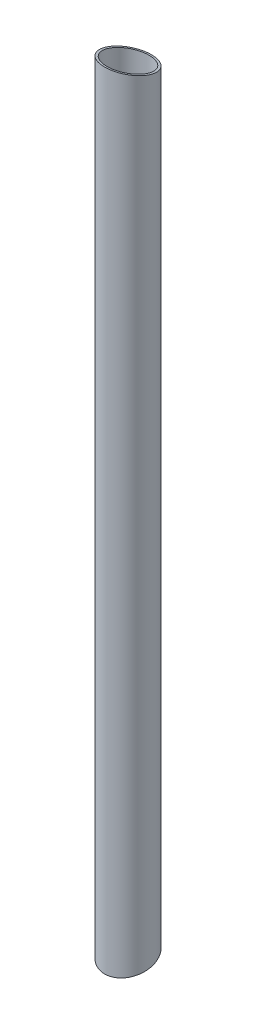
ISO-10303-21;
HEADER;
FILE_DESCRIPTION(('STEP AP214'),'2;1');
FILE_NAME('part.step','',(''),(''),'','','');
FILE_SCHEMA(('AUTOMOTIVE_DESIGN { 1 0 10303 214 1 1 1 1 }'));
ENDSEC;
DATA;
#1=APPLICATION_CONTEXT('core data for automotive mechanical design processes');
#2=APPLICATION_PROTOCOL_DEFINITION('international standard','automotive_design',2000,#1);
#3=PRODUCT_CONTEXT('',#1,'mechanical');
#4=PRODUCT('Part','Part','',(#3));
#5=PRODUCT_RELATED_PRODUCT_CATEGORY('part','',(#4));
#6=PRODUCT_DEFINITION_FORMATION('','',#4);
#7=PRODUCT_DEFINITION_CONTEXT('part definition',#1,'design');
#8=PRODUCT_DEFINITION('design','',#6,#7);
#9=PRODUCT_DEFINITION_SHAPE('','',#8);
#10=(LENGTH_UNIT() NAMED_UNIT(*) SI_UNIT(.MILLI.,.METRE.));
#11=(NAMED_UNIT(*) PLANE_ANGLE_UNIT() SI_UNIT($,.RADIAN.));
#12=(NAMED_UNIT(*) SI_UNIT($,.STERADIAN.) SOLID_ANGLE_UNIT());
#13=UNCERTAINTY_MEASURE_WITH_UNIT(LENGTH_MEASURE(1.E-05),#10,'distance_accuracy_value','');
#14=(GEOMETRIC_REPRESENTATION_CONTEXT(3) GLOBAL_UNCERTAINTY_ASSIGNED_CONTEXT((#13)) GLOBAL_UNIT_ASSIGNED_CONTEXT((#10,
#11,#12)) REPRESENTATION_CONTEXT('',''));
#15=CARTESIAN_POINT('',(0.,0.,0.));
#16=DIRECTION('',(0.,0.,1.));
#17=DIRECTION('',(1.,0.,0.));
#18=AXIS2_PLACEMENT_3D('',#15,#16,#17);
#19=CARTESIAN_POINT('',(-642.62,-196.85,0.));
#20=DIRECTION('',(0.,1.,0.));
#21=DIRECTION('',(0.,0.,1.));
#22=AXIS2_PLACEMENT_3D('',#19,#20,#21);
#23=CYLINDRICAL_SURFACE('',#22,11.4554);
#24=CARTESIAN_POINT('',(-642.62,-210.002229432809,0.));
#25=DIRECTION('',(0.,-0.96561575852067,-0.259973473447873));
#26=DIRECTION('',(0.,0.259973473447873,-0.96561575852067));
#27=AXIS2_PLACEMENT_3D('',#24,#25,#26);
#28=ELLIPSE('',#27,11.863310948394,11.4554);
#29=CARTESIAN_POINT('',(-642.62,-206.918083278963,-11.4554));
#30=VERTEX_POINT('',#29);
#31=EDGE_CURVE('E46',#30,#30,#28,.T.);
#32=ORIENTED_EDGE('',*,*,#31,.T.);
#33=EDGE_LOOP('',(#32));
#34=FACE_BOUND('',#33,.T.);
#35=CARTESIAN_POINT('',(-642.62,210.002229432809,0.));
#36=DIRECTION('',(0.,0.96561575852067,-0.259973473447873));
#37=DIRECTION('',(0.,0.259973473447873,0.96561575852067));
#38=AXIS2_PLACEMENT_3D('',#35,#36,#37);
#39=ELLIPSE('',#38,11.863310948394,11.4554);
#40=CARTESIAN_POINT('',(-642.62,213.086375586656,11.4554));
#41=VERTEX_POINT('',#40);
#42=EDGE_CURVE('E36',#41,#41,#39,.T.);
#43=ORIENTED_EDGE('',*,*,#42,.T.);
#44=EDGE_LOOP('',(#43));
#45=FACE_BOUND('',#44,.T.);
#46=ADVANCED_FACE('F32',(#34,#45),#23,.F.);
#47=CARTESIAN_POINT('',(-642.62,-196.85,0.));
#48=DIRECTION('',(0.,1.,0.));
#49=DIRECTION('',(0.,0.,1.));
#50=AXIS2_PLACEMENT_3D('',#47,#48,#49);
#51=CYLINDRICAL_SURFACE('',#50,12.7);
#52=CARTESIAN_POINT('',(-642.62,-210.002229432809,0.));
#53=DIRECTION('',(0.,-0.96561575852067,-0.259973473447873));
#54=DIRECTION('',(0.,0.259973473447873,-0.96561575852067));
#55=AXIS2_PLACEMENT_3D('',#52,#53,#54);
#56=ELLIPSE('',#55,13.1522294328092,12.7);
#57=CARTESIAN_POINT('',(-642.62,-206.582998663579,-12.6999999999999));
#58=VERTEX_POINT('',#57);
#59=EDGE_CURVE('E40',#58,#58,#56,.T.);
#60=ORIENTED_EDGE('',*,*,#59,.F.);
#61=EDGE_LOOP('',(#60));
#62=FACE_BOUND('',#61,.T.);
#63=CARTESIAN_POINT('',(-642.62,210.002229432809,0.));
#64=DIRECTION('',(0.,0.96561575852067,-0.259973473447873));
#65=DIRECTION('',(0.,0.259973473447873,0.96561575852067));
#66=AXIS2_PLACEMENT_3D('',#63,#64,#65);
#67=ELLIPSE('',#66,13.1522294328092,12.7);
#68=CARTESIAN_POINT('',(-642.62,213.42146020204,12.7));
#69=VERTEX_POINT('',#68);
#70=EDGE_CURVE('E10',#69,#69,#67,.T.);
#71=ORIENTED_EDGE('',*,*,#70,.F.);
#72=EDGE_LOOP('',(#71));
#73=FACE_BOUND('',#72,.T.);
#74=ADVANCED_FACE('F59',(#62,#73),#51,.T.);
#75=CARTESIAN_POINT('',(-655.319999999999,-209.113320133213,-3.30166311278795));
#76=DIRECTION('',(0.,-0.96561575852067,-0.259973473447873));
#77=DIRECTION('',(0.,0.259973473447873,-0.96561575852067));
#78=AXIS2_PLACEMENT_3D('',#75,#76,#77);
#79=PLANE('',#78);
#80=ORIENTED_EDGE('',*,*,#31,.F.);
#81=EDGE_LOOP('',(#80));
#82=FACE_BOUND('',#81,.T.);
#83=ORIENTED_EDGE('',*,*,#59,.T.);
#84=EDGE_LOOP('',(#83));
#85=FACE_BOUND('',#84,.T.);
#86=ADVANCED_FACE('F55',(#82,#85),#79,.T.);
#87=CARTESIAN_POINT('',(-629.92,209.113320133213,-3.30166311278791));
#88=DIRECTION('',(0.,0.96561575852067,-0.259973473447873));
#89=DIRECTION('',(0.,0.259973473447873,0.96561575852067));
#90=AXIS2_PLACEMENT_3D('',#87,#88,#89);
#91=PLANE('',#90);
#92=ORIENTED_EDGE('',*,*,#42,.F.);
#93=EDGE_LOOP('',(#92));
#94=FACE_BOUND('',#93,.T.);
#95=ORIENTED_EDGE('',*,*,#70,.T.);
#96=EDGE_LOOP('',(#95));
#97=FACE_BOUND('',#96,.T.);
#98=ADVANCED_FACE('F34',(#94,#97),#91,.T.);
#99=CLOSED_SHELL('',(#46,#74,#86,#98));
#100=MANIFOLD_SOLID_BREP('B2',#99);
#101=ADVANCED_BREP_SHAPE_REPRESENTATION('',(#18,#100),#14);
#102=SHAPE_DEFINITION_REPRESENTATION(#9,#101);
ENDSEC;
END-ISO-10303-21;
